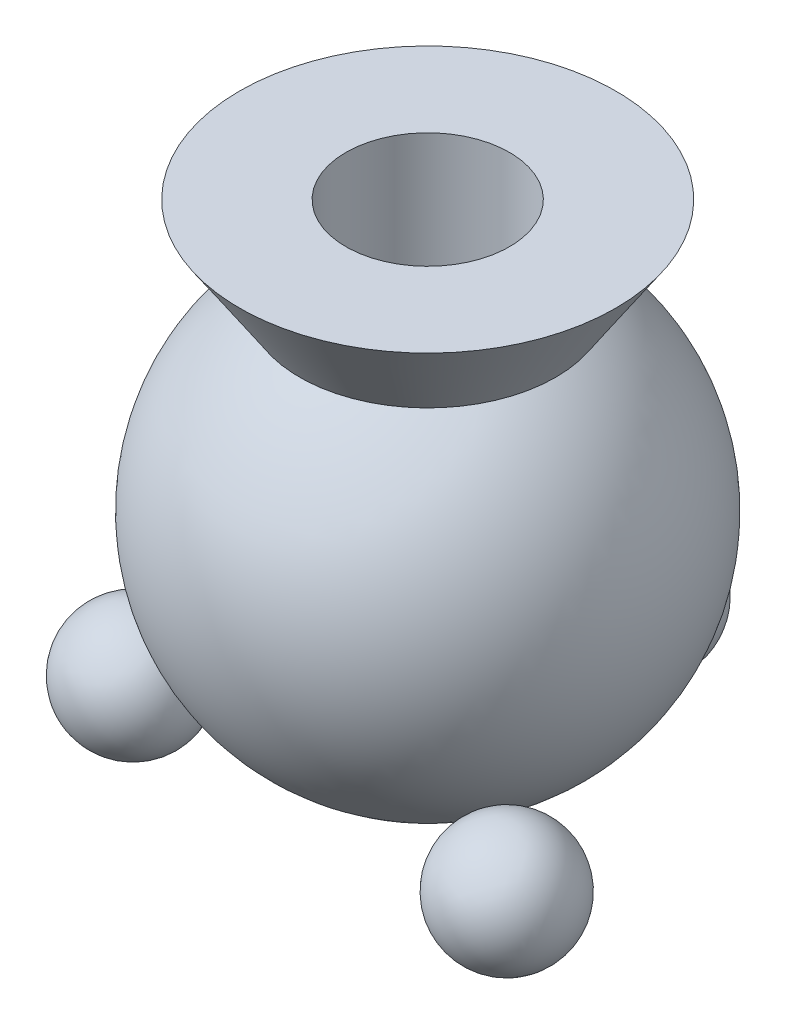
ISO-10303-21;
HEADER;
FILE_DESCRIPTION(('STEP AP214'),'2;1');
FILE_NAME('part.step','',(''),(''),'','','');
FILE_SCHEMA(('AUTOMOTIVE_DESIGN { 1 0 10303 214 1 1 1 1 }'));
ENDSEC;
DATA;
#1=APPLICATION_CONTEXT('core data for automotive mechanical design processes');
#2=APPLICATION_PROTOCOL_DEFINITION('international standard','automotive_design',2000,#1);
#3=PRODUCT_CONTEXT('',#1,'mechanical');
#4=PRODUCT('Part','Part','',(#3));
#5=PRODUCT_RELATED_PRODUCT_CATEGORY('part','',(#4));
#6=PRODUCT_DEFINITION_FORMATION('','',#4);
#7=PRODUCT_DEFINITION_CONTEXT('part definition',#1,'design');
#8=PRODUCT_DEFINITION('design','',#6,#7);
#9=PRODUCT_DEFINITION_SHAPE('','',#8);
#10=(LENGTH_UNIT() NAMED_UNIT(*) SI_UNIT(.MILLI.,.METRE.));
#11=(NAMED_UNIT(*) PLANE_ANGLE_UNIT() SI_UNIT($,.RADIAN.));
#12=(NAMED_UNIT(*) SI_UNIT($,.STERADIAN.) SOLID_ANGLE_UNIT());
#13=UNCERTAINTY_MEASURE_WITH_UNIT(LENGTH_MEASURE(1.E-05),#10,'distance_accuracy_value','');
#14=(GEOMETRIC_REPRESENTATION_CONTEXT(3) GLOBAL_UNCERTAINTY_ASSIGNED_CONTEXT((#13)) GLOBAL_UNIT_ASSIGNED_CONTEXT((#10,
#11,#12)) REPRESENTATION_CONTEXT('',''));
#15=CARTESIAN_POINT('',(0.,0.,0.));
#16=DIRECTION('',(0.,0.,1.));
#17=DIRECTION('',(1.,0.,0.));
#18=AXIS2_PLACEMENT_3D('',#15,#16,#17);
#19=CARTESIAN_POINT('',(22.8483986000279,4.76974489832239,13.1915290822777));
#20=DIRECTION('',(-0.662272423189215,0.644355220338481,-0.382363161805151));
#21=DIRECTION('',(-0.558027989874247,-0.764726323610314,-0.322177610169235));
#22=AXIS2_PLACEMENT_3D('',#19,#20,#21);
#23=SPHERICAL_SURFACE('',#22,7.5);
#24=CARTESIAN_POINT('',(17.8813554261088,9.602409050861,10.3238053687391));
#25=VERTEX_POINT('',#24);
#26=VERTEX_LOOP('',#25);
#27=FACE_BOUND('',#26,.T.);
#28=ADVANCED_FACE('F36',(#27),#23,.T.);
#29=CLOSED_SHELL('',(#28));
#30=MANIFOLD_SOLID_BREP('B2',#29);
#31=CARTESIAN_POINT('',(-22.8483986000277,4.76974489832239,13.191529082278));
#32=DIRECTION('',(0.66227242318921,0.644355220338481,-0.38236316180516));
#33=DIRECTION('',(0.558027989874243,-0.764726323610314,-0.322177610169243));
#34=AXIS2_PLACEMENT_3D('',#31,#32,#33);
#35=SPHERICAL_SURFACE('',#34,7.5);
#36=CARTESIAN_POINT('',(-17.8813554261087,9.602409050861,10.3238053687393));
#37=VERTEX_POINT('',#36);
#38=VERTEX_LOOP('',#37);
#39=FACE_BOUND('',#38,.T.);
#40=ADVANCED_FACE('F55',(#39),#35,.T.);
#41=CLOSED_SHELL('',(#40));
#42=MANIFOLD_SOLID_BREP('B6',#41);
#43=CARTESIAN_POINT('',(0.,4.76974489832239,-26.3830581645558));
#44=DIRECTION('',(0.,0.644355220338481,0.764726323610314));
#45=DIRECTION('',(0.,-0.764726323610314,0.644355220338481));
#46=AXIS2_PLACEMENT_3D('',#43,#44,#45);
#47=SPHERICAL_SURFACE('',#46,7.5);
#48=CARTESIAN_POINT('',(0.,9.602409050861,-20.6476107374785));
#49=VERTEX_POINT('',#48);
#50=VERTEX_LOOP('',#49);
#51=FACE_BOUND('',#50,.T.);
#52=ADVANCED_FACE('F77',(#51),#47,.T.);
#53=CLOSED_SHELL('',(#52));
#54=MANIFOLD_SOLID_BREP('B32',#53);
#55=CARTESIAN_POINT('',(0.,27.,0.));
#56=DIRECTION('',(0.,1.,0.));
#57=DIRECTION('',(1.,0.,0.));
#58=AXIS2_PLACEMENT_3D('',#55,#56,#57);
#59=SPHERICAL_SURFACE('',#58,27.);
#60=CARTESIAN_POINT('',(0.,9.602409050861,-20.6476107374785));
#61=VERTEX_POINT('',#60);
#62=VERTEX_LOOP('',#61);
#63=FACE_BOUND('',#62,.T.);
#64=CARTESIAN_POINT('',(0.,49.,0.));
#65=DIRECTION('',(0.,1.,0.));
#66=DIRECTION('',(-1.,0.,0.));
#67=AXIS2_PLACEMENT_3D('',#64,#65,#66);
#68=CIRCLE('',#67,15.6524758424985);
#69=CARTESIAN_POINT('',(-15.6524758424985,49.,0.));
#70=VERTEX_POINT('',#69);
#71=EDGE_CURVE('E75',#70,#70,#68,.T.);
#72=ORIENTED_EDGE('',*,*,#71,.F.);
#73=EDGE_LOOP('',(#72));
#74=FACE_BOUND('',#73,.T.);
#75=ADVANCED_FACE('F90',(#63,#74),#59,.T.);
#76=CARTESIAN_POINT('',(0.,49.,0.));
#77=DIRECTION('',(0.,1.,0.));
#78=DIRECTION('',(-1.,0.,0.));
#79=AXIS2_PLACEMENT_3D('',#76,#77,#78);
#80=CONICAL_SURFACE('',#79,15.6524758424985,0.588895200634732);
#81=CARTESIAN_POINT('',(0.,60.,0.));
#82=DIRECTION('',(0.,1.,0.));
#83=DIRECTION('',(-1.,0.,0.));
#84=AXIS2_PLACEMENT_3D('',#81,#82,#83);
#85=CIRCLE('',#84,23.);
#86=CARTESIAN_POINT('',(-23.,60.,0.));
#87=VERTEX_POINT('',#86);
#88=EDGE_CURVE('E96',#87,#87,#85,.T.);
#89=ORIENTED_EDGE('',*,*,#88,.F.);
#90=EDGE_LOOP('',(#89));
#91=FACE_BOUND('',#90,.T.);
#92=ORIENTED_EDGE('',*,*,#71,.T.);
#93=EDGE_LOOP('',(#92));
#94=FACE_BOUND('',#93,.T.);
#95=ADVANCED_FACE('F101',(#91,#94),#80,.T.);
#96=CARTESIAN_POINT('',(10.,60.,0.));
#97=DIRECTION('',(0.,-1.,0.));
#98=DIRECTION('',(1.,0.,0.));
#99=AXIS2_PLACEMENT_3D('',#96,#97,#98);
#100=PLANE('',#99);
#101=CARTESIAN_POINT('',(0.,60.,0.));
#102=DIRECTION('',(0.,1.,0.));
#103=DIRECTION('',(-1.,0.,0.));
#104=AXIS2_PLACEMENT_3D('',#101,#102,#103);
#105=CIRCLE('',#104,10.);
#106=CARTESIAN_POINT('',(-9.99999999999999,60.,0.));
#107=VERTEX_POINT('',#106);
#108=EDGE_CURVE('E126',#107,#107,#105,.T.);
#109=ORIENTED_EDGE('',*,*,#108,.F.);
#110=EDGE_LOOP('',(#109));
#111=FACE_BOUND('',#110,.T.);
#112=ORIENTED_EDGE('',*,*,#88,.T.);
#113=EDGE_LOOP('',(#112));
#114=FACE_BOUND('',#113,.T.);
#115=ADVANCED_FACE('F105',(#111,#114),#100,.F.);
#116=CARTESIAN_POINT('',(0.,35.,0.));
#117=DIRECTION('',(0.,1.,0.));
#118=DIRECTION('',(-1.,0.,0.));
#119=AXIS2_PLACEMENT_3D('',#116,#117,#118);
#120=CYLINDRICAL_SURFACE('',#119,10.);
#121=CARTESIAN_POINT('',(0.,35.,0.));
#122=DIRECTION('',(0.,1.,0.));
#123=DIRECTION('',(-1.,0.,0.));
#124=AXIS2_PLACEMENT_3D('',#121,#122,#123);
#125=CIRCLE('',#124,10.);
#126=CARTESIAN_POINT('',(-10.,35.,0.));
#127=VERTEX_POINT('',#126);
#128=EDGE_CURVE('E125',#127,#127,#125,.T.);
#129=ORIENTED_EDGE('',*,*,#128,.F.);
#130=EDGE_LOOP('',(#129));
#131=FACE_BOUND('',#130,.T.);
#132=ORIENTED_EDGE('',*,*,#108,.T.);
#133=EDGE_LOOP('',(#132));
#134=FACE_BOUND('',#133,.T.);
#135=ADVANCED_FACE('F110',(#131,#134),#120,.F.);
#136=CARTESIAN_POINT('',(0.,35.,0.));
#137=DIRECTION('',(0.,-1.,0.));
#138=DIRECTION('',(1.,0.,0.));
#139=AXIS2_PLACEMENT_3D('',#136,#137,#138);
#140=PLANE('',#139);
#141=ORIENTED_EDGE('',*,*,#128,.T.);
#142=EDGE_LOOP('',(#141));
#143=FACE_BOUND('',#142,.T.);
#144=ADVANCED_FACE('F117',(#143),#140,.F.);
#145=CLOSED_SHELL('',(#75,#95,#115,#135,#144));
#146=MANIFOLD_SOLID_BREP('B51',#145);
#147=ADVANCED_BREP_SHAPE_REPRESENTATION('',(#18,#30,#42,#54,#146),#14);
#148=SHAPE_DEFINITION_REPRESENTATION(#9,#147);
ENDSEC;
END-ISO-10303-21;
